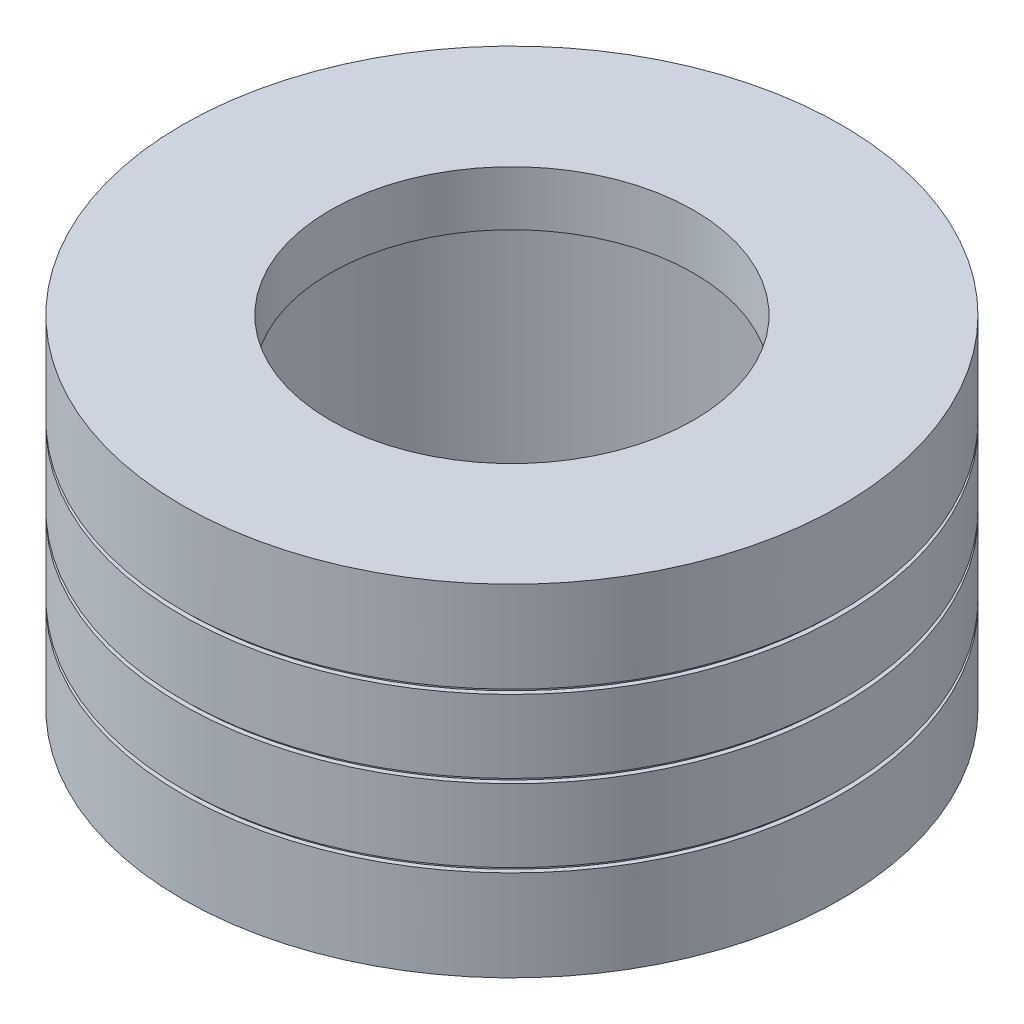
ISO-10303-21;
HEADER;
FILE_DESCRIPTION(('STEP AP214'),'2;1');
FILE_NAME('part.step','',(''),(''),'','','');
FILE_SCHEMA(('AUTOMOTIVE_DESIGN { 1 0 10303 214 1 1 1 1 }'));
ENDSEC;
DATA;
#1=APPLICATION_CONTEXT('core data for automotive mechanical design processes');
#2=APPLICATION_PROTOCOL_DEFINITION('international standard','automotive_design',2000,#1);
#3=PRODUCT_CONTEXT('',#1,'mechanical');
#4=PRODUCT('Part','Part','',(#3));
#5=PRODUCT_RELATED_PRODUCT_CATEGORY('part','',(#4));
#6=PRODUCT_DEFINITION_FORMATION('','',#4);
#7=PRODUCT_DEFINITION_CONTEXT('part definition',#1,'design');
#8=PRODUCT_DEFINITION('design','',#6,#7);
#9=PRODUCT_DEFINITION_SHAPE('','',#8);
#10=(LENGTH_UNIT() NAMED_UNIT(*) SI_UNIT(.MILLI.,.METRE.));
#11=(NAMED_UNIT(*) PLANE_ANGLE_UNIT() SI_UNIT($,.RADIAN.));
#12=(NAMED_UNIT(*) SI_UNIT($,.STERADIAN.) SOLID_ANGLE_UNIT());
#13=UNCERTAINTY_MEASURE_WITH_UNIT(LENGTH_MEASURE(1.E-05),#10,'distance_accuracy_value','');
#14=(GEOMETRIC_REPRESENTATION_CONTEXT(3) GLOBAL_UNCERTAINTY_ASSIGNED_CONTEXT((#13)) GLOBAL_UNIT_ASSIGNED_CONTEXT((#10,
#11,#12)) REPRESENTATION_CONTEXT('',''));
#15=CARTESIAN_POINT('',(0.,0.,0.));
#16=DIRECTION('',(0.,0.,1.));
#17=DIRECTION('',(1.,0.,0.));
#18=AXIS2_PLACEMENT_3D('',#15,#16,#17);
#19=CARTESIAN_POINT('',(0.,7.5,0.));
#20=DIRECTION('',(0.,-1.,0.));
#21=DIRECTION('',(0.,0.,-1.));
#22=AXIS2_PLACEMENT_3D('',#19,#20,#21);
#23=CYLINDRICAL_SURFACE('',#22,7.25);
#24=CARTESIAN_POINT('',(0.,2.,0.));
#25=DIRECTION('',(0.,1.,0.));
#26=DIRECTION('',(-1.,0.,0.));
#27=AXIS2_PLACEMENT_3D('',#24,#25,#26);
#28=CIRCLE('',#27,7.24999999999997);
#29=CARTESIAN_POINT('',(-7.24999999999997,2.,0.));
#30=VERTEX_POINT('',#29);
#31=EDGE_CURVE('E60',#30,#30,#28,.T.);
#32=ORIENTED_EDGE('',*,*,#31,.F.);
#33=EDGE_LOOP('',(#32));
#34=FACE_BOUND('',#33,.T.);
#35=CARTESIAN_POINT('',(0.,0.,0.));
#36=DIRECTION('',(0.,1.,0.));
#37=DIRECTION('',(0.,0.,1.));
#38=AXIS2_PLACEMENT_3D('',#35,#36,#37);
#39=CIRCLE('',#38,7.25);
#40=CARTESIAN_POINT('',(0.,0.,7.25));
#41=VERTEX_POINT('',#40);
#42=EDGE_CURVE('E39',#41,#41,#39,.T.);
#43=ORIENTED_EDGE('',*,*,#42,.T.);
#44=EDGE_LOOP('',(#43));
#45=FACE_BOUND('',#44,.T.);
#46=ADVANCED_FACE('F35',(#34,#45),#23,.T.);
#47=CARTESIAN_POINT('',(0.,5.5,0.));
#48=DIRECTION('',(0.,1.,0.));
#49=DIRECTION('',(-1.,0.,0.));
#50=AXIS2_PLACEMENT_3D('',#47,#48,#49);
#51=CIRCLE('',#50,7.25);
#52=CARTESIAN_POINT('',(-7.25,5.5,0.));
#53=VERTEX_POINT('',#52);
#54=EDGE_CURVE('E76',#53,#53,#51,.T.);
#55=ORIENTED_EDGE('',*,*,#54,.T.);
#56=EDGE_LOOP('',(#55));
#57=FACE_BOUND('',#56,.T.);
#58=CARTESIAN_POINT('',(0.,7.5,0.));
#59=DIRECTION('',(0.,1.,0.));
#60=DIRECTION('',(0.,0.,1.));
#61=AXIS2_PLACEMENT_3D('',#58,#59,#60);
#62=CIRCLE('',#61,7.25);
#63=CARTESIAN_POINT('',(0.,7.5,7.25));
#64=VERTEX_POINT('',#63);
#65=EDGE_CURVE('E10',#64,#64,#62,.T.);
#66=ORIENTED_EDGE('',*,*,#65,.F.);
#67=EDGE_LOOP('',(#66));
#68=FACE_BOUND('',#67,.T.);
#69=ADVANCED_FACE('F37',(#57,#68),#23,.T.);
#70=CARTESIAN_POINT('',(0.,7.5,0.));
#71=DIRECTION('',(0.,1.,0.));
#72=DIRECTION('',(0.,0.,1.));
#73=AXIS2_PLACEMENT_3D('',#70,#71,#72);
#74=PLANE('',#73);
#75=CARTESIAN_POINT('',(0.,7.5,0.));
#76=DIRECTION('',(0.,1.,0.));
#77=DIRECTION('',(0.,0.,1.));
#78=AXIS2_PLACEMENT_3D('',#75,#76,#77);
#79=CIRCLE('',#78,4.);
#80=CARTESIAN_POINT('',(0.,7.5,4.));
#81=VERTEX_POINT('',#80);
#82=EDGE_CURVE('E56',#81,#81,#79,.T.);
#83=ORIENTED_EDGE('',*,*,#82,.F.);
#84=EDGE_LOOP('',(#83));
#85=FACE_BOUND('',#84,.T.);
#86=ORIENTED_EDGE('',*,*,#65,.T.);
#87=EDGE_LOOP('',(#86));
#88=FACE_BOUND('',#87,.T.);
#89=ADVANCED_FACE('F170',(#85,#88),#74,.T.);
#90=CARTESIAN_POINT('',(0.,0.,0.));
#91=DIRECTION('',(0.,1.,0.));
#92=DIRECTION('',(0.,0.,1.));
#93=AXIS2_PLACEMENT_3D('',#90,#91,#92);
#94=PLANE('',#93);
#95=CARTESIAN_POINT('',(0.,0.,0.));
#96=DIRECTION('',(0.,-1.,0.));
#97=DIRECTION('',(0.,0.,-1.));
#98=AXIS2_PLACEMENT_3D('',#95,#96,#97);
#99=CIRCLE('',#98,6.4);
#100=CARTESIAN_POINT('',(0.,0.,-6.4));
#101=VERTEX_POINT('',#100);
#102=EDGE_CURVE('E48',#101,#101,#99,.T.);
#103=ORIENTED_EDGE('',*,*,#102,.F.);
#104=EDGE_LOOP('',(#103));
#105=FACE_BOUND('',#104,.T.);
#106=ORIENTED_EDGE('',*,*,#42,.F.);
#107=EDGE_LOOP('',(#106));
#108=FACE_BOUND('',#107,.T.);
#109=ADVANCED_FACE('F167',(#105,#108),#94,.F.);
#110=CARTESIAN_POINT('',(0.,6.3,0.));
#111=DIRECTION('',(0.,-1.,0.));
#112=DIRECTION('',(0.,0.,-1.));
#113=AXIS2_PLACEMENT_3D('',#110,#111,#112);
#114=CYLINDRICAL_SURFACE('',#113,6.4);
#115=CARTESIAN_POINT('',(0.,6.3,0.));
#116=DIRECTION('',(0.,-1.,0.));
#117=DIRECTION('',(0.,0.,-1.));
#118=AXIS2_PLACEMENT_3D('',#115,#116,#117);
#119=CIRCLE('',#118,6.4);
#120=CARTESIAN_POINT('',(0.,6.3,-6.4));
#121=VERTEX_POINT('',#120);
#122=EDGE_CURVE('E46',#121,#121,#119,.T.);
#123=ORIENTED_EDGE('',*,*,#122,.F.);
#124=EDGE_LOOP('',(#123));
#125=FACE_BOUND('',#124,.T.);
#126=ORIENTED_EDGE('',*,*,#102,.T.);
#127=EDGE_LOOP('',(#126));
#128=FACE_BOUND('',#127,.T.);
#129=ADVANCED_FACE('F169',(#125,#128),#114,.F.);
#130=CARTESIAN_POINT('',(0.,6.3,0.));
#131=DIRECTION('',(0.,-1.,0.));
#132=DIRECTION('',(0.,0.,-1.));
#133=AXIS2_PLACEMENT_3D('',#130,#131,#132);
#134=PLANE('',#133);
#135=CARTESIAN_POINT('',(0.,6.3,0.));
#136=DIRECTION('',(0.,-1.,0.));
#137=DIRECTION('',(0.,0.,-1.));
#138=AXIS2_PLACEMENT_3D('',#135,#136,#137);
#139=CIRCLE('',#138,4.);
#140=CARTESIAN_POINT('',(0.,6.3,-4.));
#141=VERTEX_POINT('',#140);
#142=EDGE_CURVE('E51',#141,#141,#139,.F.);
#143=ORIENTED_EDGE('',*,*,#142,.T.);
#144=EDGE_LOOP('',(#143));
#145=FACE_BOUND('',#144,.T.);
#146=ORIENTED_EDGE('',*,*,#122,.T.);
#147=EDGE_LOOP('',(#146));
#148=FACE_BOUND('',#147,.T.);
#149=ADVANCED_FACE('F176',(#145,#148),#134,.T.);
#150=CARTESIAN_POINT('',(0.,-5.01370849898476,0.));
#151=DIRECTION('',(0.,1.,0.));
#152=DIRECTION('',(0.,0.,1.));
#153=AXIS2_PLACEMENT_3D('',#150,#151,#152);
#154=CYLINDRICAL_SURFACE('',#153,4.);
#155=ORIENTED_EDGE('',*,*,#82,.T.);
#156=EDGE_LOOP('',(#155));
#157=FACE_BOUND('',#156,.T.);
#158=ORIENTED_EDGE('',*,*,#142,.F.);
#159=EDGE_LOOP('',(#158));
#160=FACE_BOUND('',#159,.T.);
#161=ADVANCED_FACE('F159',(#157,#160),#154,.F.);
#162=CARTESIAN_POINT('',(-7.24999999999997,2.,0.));
#163=DIRECTION('',(0.,-1.,0.));
#164=DIRECTION('',(1.,0.,0.));
#165=AXIS2_PLACEMENT_3D('',#162,#163,#164);
#166=PLANE('',#165);
#167=CARTESIAN_POINT('',(0.,2.,0.));
#168=DIRECTION('',(0.,1.,0.));
#169=DIRECTION('',(-1.,0.,0.));
#170=AXIS2_PLACEMENT_3D('',#167,#168,#169);
#171=CIRCLE('',#170,7.14999999999997);
#172=CARTESIAN_POINT('',(-7.14999999999997,2.,0.));
#173=VERTEX_POINT('',#172);
#174=EDGE_CURVE('E64',#173,#173,#171,.T.);
#175=ORIENTED_EDGE('',*,*,#174,.F.);
#176=EDGE_LOOP('',(#175));
#177=FACE_BOUND('',#176,.T.);
#178=ORIENTED_EDGE('',*,*,#31,.T.);
#179=EDGE_LOOP('',(#178));
#180=FACE_BOUND('',#179,.T.);
#181=ADVANCED_FACE('F153',(#177,#180),#166,.F.);
#182=CARTESIAN_POINT('',(0.,7.5,0.));
#183=DIRECTION('',(0.,1.,0.));
#184=DIRECTION('',(-1.,0.,0.));
#185=AXIS2_PLACEMENT_3D('',#182,#183,#184);
#186=CYLINDRICAL_SURFACE('',#185,7.14999999999997);
#187=CARTESIAN_POINT('',(0.,2.1,0.));
#188=DIRECTION('',(0.,1.,0.));
#189=DIRECTION('',(-1.,0.,0.));
#190=AXIS2_PLACEMENT_3D('',#187,#188,#189);
#191=CIRCLE('',#190,7.14999999999997);
#192=CARTESIAN_POINT('',(-7.14999999999996,2.1,0.));
#193=VERTEX_POINT('',#192);
#194=EDGE_CURVE('E67',#193,#193,#191,.T.);
#195=ORIENTED_EDGE('',*,*,#194,.F.);
#196=EDGE_LOOP('',(#195));
#197=FACE_BOUND('',#196,.T.);
#198=ORIENTED_EDGE('',*,*,#174,.T.);
#199=EDGE_LOOP('',(#198));
#200=FACE_BOUND('',#199,.T.);
#201=ADVANCED_FACE('F147',(#197,#200),#186,.T.);
#202=CARTESIAN_POINT('',(-7.24999999999996,2.1,0.));
#203=DIRECTION('',(0.,1.,0.));
#204=DIRECTION('',(-1.,0.,0.));
#205=AXIS2_PLACEMENT_3D('',#202,#203,#204);
#206=PLANE('',#205);
#207=CARTESIAN_POINT('',(0.,2.1,0.));
#208=DIRECTION('',(0.,1.,0.));
#209=DIRECTION('',(-1.,0.,0.));
#210=AXIS2_PLACEMENT_3D('',#207,#208,#209);
#211=CIRCLE('',#210,7.24999999999997);
#212=CARTESIAN_POINT('',(-7.24999999999996,2.1,0.));
#213=VERTEX_POINT('',#212);
#214=EDGE_CURVE('E70',#213,#213,#211,.T.);
#215=ORIENTED_EDGE('',*,*,#214,.F.);
#216=EDGE_LOOP('',(#215));
#217=FACE_BOUND('',#216,.T.);
#218=ORIENTED_EDGE('',*,*,#194,.T.);
#219=EDGE_LOOP('',(#218));
#220=FACE_BOUND('',#219,.T.);
#221=ADVANCED_FACE('F114',(#217,#220),#206,.F.);
#222=CARTESIAN_POINT('',(-7.25,5.4,0.));
#223=DIRECTION('',(0.,-1.,0.));
#224=DIRECTION('',(1.,0.,0.));
#225=AXIS2_PLACEMENT_3D('',#222,#223,#224);
#226=PLANE('',#225);
#227=CARTESIAN_POINT('',(0.,5.4,0.));
#228=DIRECTION('',(0.,1.,0.));
#229=DIRECTION('',(-1.,0.,0.));
#230=AXIS2_PLACEMENT_3D('',#227,#228,#229);
#231=CIRCLE('',#230,7.15);
#232=CARTESIAN_POINT('',(-7.15,5.4,0.));
#233=VERTEX_POINT('',#232);
#234=EDGE_CURVE('E87',#233,#233,#231,.T.);
#235=ORIENTED_EDGE('',*,*,#234,.F.);
#236=EDGE_LOOP('',(#235));
#237=FACE_BOUND('',#236,.T.);
#238=CARTESIAN_POINT('',(0.,5.4,0.));
#239=DIRECTION('',(0.,1.,0.));
#240=DIRECTION('',(-1.,0.,0.));
#241=AXIS2_PLACEMENT_3D('',#238,#239,#240);
#242=CIRCLE('',#241,7.25);
#243=CARTESIAN_POINT('',(-7.25,5.4,0.));
#244=VERTEX_POINT('',#243);
#245=EDGE_CURVE('E59',#244,#244,#242,.T.);
#246=ORIENTED_EDGE('',*,*,#245,.T.);
#247=EDGE_LOOP('',(#246));
#248=FACE_BOUND('',#247,.T.);
#249=ADVANCED_FACE('F108',(#237,#248),#226,.F.);
#250=CARTESIAN_POINT('',(0.,7.5,0.));
#251=DIRECTION('',(0.,1.,0.));
#252=DIRECTION('',(-1.,0.,0.));
#253=AXIS2_PLACEMENT_3D('',#250,#251,#252);
#254=CYLINDRICAL_SURFACE('',#253,7.15);
#255=CARTESIAN_POINT('',(0.,5.5,0.));
#256=DIRECTION('',(0.,1.,0.));
#257=DIRECTION('',(-1.,0.,0.));
#258=AXIS2_PLACEMENT_3D('',#255,#256,#257);
#259=CIRCLE('',#258,7.15);
#260=CARTESIAN_POINT('',(-7.15,5.5,0.));
#261=VERTEX_POINT('',#260);
#262=EDGE_CURVE('E90',#261,#261,#259,.T.);
#263=ORIENTED_EDGE('',*,*,#262,.F.);
#264=EDGE_LOOP('',(#263));
#265=FACE_BOUND('',#264,.T.);
#266=ORIENTED_EDGE('',*,*,#234,.T.);
#267=EDGE_LOOP('',(#266));
#268=FACE_BOUND('',#267,.T.);
#269=ADVANCED_FACE('F102',(#265,#268),#254,.T.);
#270=CARTESIAN_POINT('',(-7.25,5.5,0.));
#271=DIRECTION('',(0.,1.,0.));
#272=DIRECTION('',(-1.,0.,0.));
#273=AXIS2_PLACEMENT_3D('',#270,#271,#272);
#274=PLANE('',#273);
#275=ORIENTED_EDGE('',*,*,#54,.F.);
#276=EDGE_LOOP('',(#275));
#277=FACE_BOUND('',#276,.T.);
#278=ORIENTED_EDGE('',*,*,#262,.T.);
#279=EDGE_LOOP('',(#278));
#280=FACE_BOUND('',#279,.T.);
#281=ADVANCED_FACE('F98',(#277,#280),#274,.F.);
#282=CARTESIAN_POINT('',(0.,3.7,0.));
#283=DIRECTION('',(0.,1.,0.));
#284=DIRECTION('',(-1.,0.,0.));
#285=AXIS2_PLACEMENT_3D('',#282,#283,#284);
#286=CIRCLE('',#285,7.24999999999998);
#287=CARTESIAN_POINT('',(-7.24999999999998,3.7,0.));
#288=VERTEX_POINT('',#287);
#289=EDGE_CURVE('E73',#288,#288,#286,.T.);
#290=ORIENTED_EDGE('',*,*,#289,.F.);
#291=EDGE_LOOP('',(#290));
#292=FACE_BOUND('',#291,.T.);
#293=ORIENTED_EDGE('',*,*,#214,.T.);
#294=EDGE_LOOP('',(#293));
#295=FACE_BOUND('',#294,.T.);
#296=ADVANCED_FACE('F101',(#292,#295),#23,.T.);
#297=ORIENTED_EDGE('',*,*,#245,.F.);
#298=EDGE_LOOP('',(#297));
#299=FACE_BOUND('',#298,.T.);
#300=CARTESIAN_POINT('',(0.,3.8,0.));
#301=DIRECTION('',(0.,1.,0.));
#302=DIRECTION('',(-1.,0.,0.));
#303=AXIS2_PLACEMENT_3D('',#300,#301,#302);
#304=CIRCLE('',#303,7.24999999999998);
#305=CARTESIAN_POINT('',(-7.24999999999998,3.8,0.));
#306=VERTEX_POINT('',#305);
#307=EDGE_CURVE('E63',#306,#306,#304,.T.);
#308=ORIENTED_EDGE('',*,*,#307,.T.);
#309=EDGE_LOOP('',(#308));
#310=FACE_BOUND('',#309,.T.);
#311=ADVANCED_FACE('F118',(#299,#310),#23,.T.);
#312=CARTESIAN_POINT('',(-7.24999999999998,3.7,0.));
#313=DIRECTION('',(0.,-1.,0.));
#314=DIRECTION('',(1.,0.,0.));
#315=AXIS2_PLACEMENT_3D('',#312,#313,#314);
#316=PLANE('',#315);
#317=CARTESIAN_POINT('',(0.,3.7,0.));
#318=DIRECTION('',(0.,1.,0.));
#319=DIRECTION('',(-1.,0.,0.));
#320=AXIS2_PLACEMENT_3D('',#317,#318,#319);
#321=CIRCLE('',#320,7.14999999999998);
#322=CARTESIAN_POINT('',(-7.14999999999998,3.7,0.));
#323=VERTEX_POINT('',#322);
#324=EDGE_CURVE('E77',#323,#323,#321,.T.);
#325=ORIENTED_EDGE('',*,*,#324,.F.);
#326=EDGE_LOOP('',(#325));
#327=FACE_BOUND('',#326,.T.);
#328=ORIENTED_EDGE('',*,*,#289,.T.);
#329=EDGE_LOOP('',(#328));
#330=FACE_BOUND('',#329,.T.);
#331=ADVANCED_FACE('F121',(#327,#330),#316,.F.);
#332=CARTESIAN_POINT('',(0.,7.5,0.));
#333=DIRECTION('',(0.,1.,0.));
#334=DIRECTION('',(-1.,0.,0.));
#335=AXIS2_PLACEMENT_3D('',#332,#333,#334);
#336=CYLINDRICAL_SURFACE('',#335,7.14999999999998);
#337=CARTESIAN_POINT('',(0.,3.8,0.));
#338=DIRECTION('',(0.,1.,0.));
#339=DIRECTION('',(-1.,0.,0.));
#340=AXIS2_PLACEMENT_3D('',#337,#338,#339);
#341=CIRCLE('',#340,7.14999999999998);
#342=CARTESIAN_POINT('',(-7.14999999999998,3.8,0.));
#343=VERTEX_POINT('',#342);
#344=EDGE_CURVE('E80',#343,#343,#341,.T.);
#345=ORIENTED_EDGE('',*,*,#344,.F.);
#346=EDGE_LOOP('',(#345));
#347=FACE_BOUND('',#346,.T.);
#348=ORIENTED_EDGE('',*,*,#324,.T.);
#349=EDGE_LOOP('',(#348));
#350=FACE_BOUND('',#349,.T.);
#351=ADVANCED_FACE('F127',(#347,#350),#336,.T.);
#352=CARTESIAN_POINT('',(-7.24999999999998,3.8,0.));
#353=DIRECTION('',(0.,1.,0.));
#354=DIRECTION('',(-1.,0.,0.));
#355=AXIS2_PLACEMENT_3D('',#352,#353,#354);
#356=PLANE('',#355);
#357=ORIENTED_EDGE('',*,*,#307,.F.);
#358=EDGE_LOOP('',(#357));
#359=FACE_BOUND('',#358,.T.);
#360=ORIENTED_EDGE('',*,*,#344,.T.);
#361=EDGE_LOOP('',(#360));
#362=FACE_BOUND('',#361,.T.);
#363=ADVANCED_FACE('F124',(#359,#362),#356,.F.);
#364=CLOSED_SHELL('',(#46,#69,#89,#109,#129,#149,#161,#181,#201,#221,#249,#269,#281,#296,#311,
#331,#351,#363));
#365=MANIFOLD_SOLID_BREP('B2',#364);
#366=ADVANCED_BREP_SHAPE_REPRESENTATION('',(#18,#365),#14);
#367=SHAPE_DEFINITION_REPRESENTATION(#9,#366);
ENDSEC;
END-ISO-10303-21;
